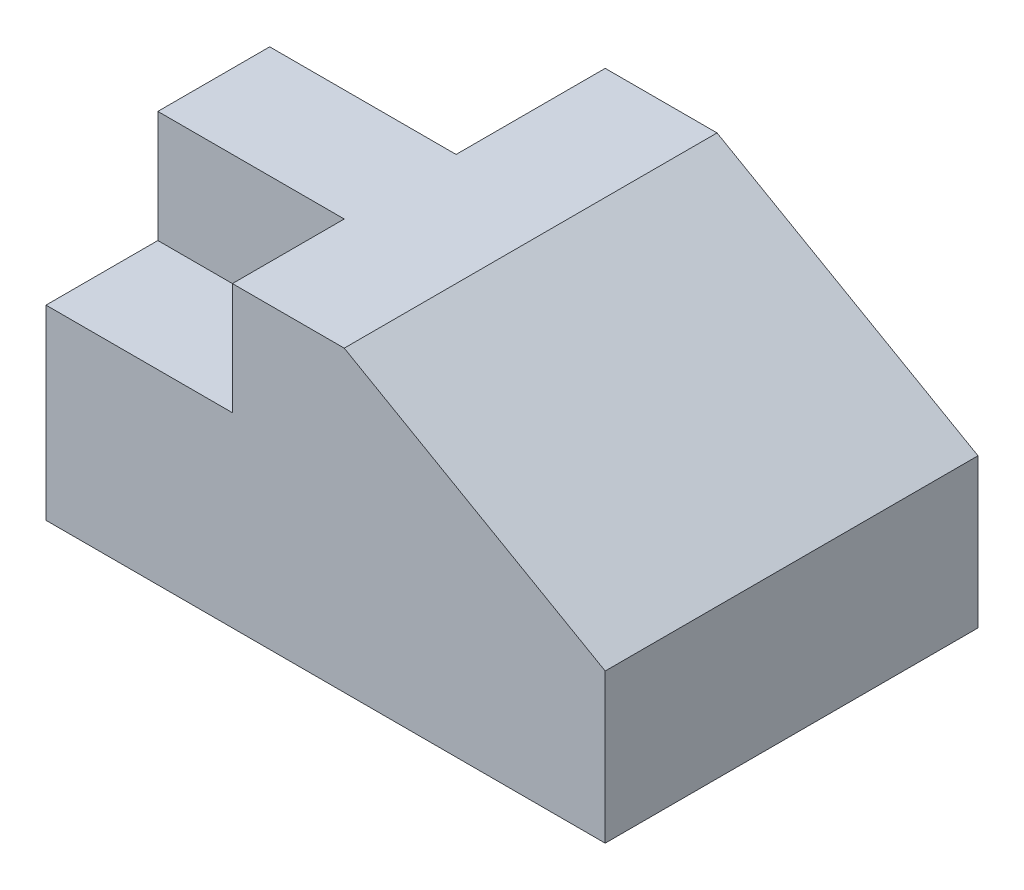
ISO-10303-21;
HEADER;
FILE_DESCRIPTION(('STEP AP214'),'2;1');
FILE_NAME('part.step','',(''),(''),'','','');
FILE_SCHEMA(('AUTOMOTIVE_DESIGN { 1 0 10303 214 1 1 1 1 }'));
ENDSEC;
DATA;
#1=APPLICATION_CONTEXT('core data for automotive mechanical design processes');
#2=APPLICATION_PROTOCOL_DEFINITION('international standard','automotive_design',2000,#1);
#3=PRODUCT_CONTEXT('',#1,'mechanical');
#4=PRODUCT('Part','Part','',(#3));
#5=PRODUCT_RELATED_PRODUCT_CATEGORY('part','',(#4));
#6=PRODUCT_DEFINITION_FORMATION('','',#4);
#7=PRODUCT_DEFINITION_CONTEXT('part definition',#1,'design');
#8=PRODUCT_DEFINITION('design','',#6,#7);
#9=PRODUCT_DEFINITION_SHAPE('','',#8);
#10=(LENGTH_UNIT() NAMED_UNIT(*) SI_UNIT(.MILLI.,.METRE.));
#11=(NAMED_UNIT(*) PLANE_ANGLE_UNIT() SI_UNIT($,.RADIAN.));
#12=(NAMED_UNIT(*) SI_UNIT($,.STERADIAN.) SOLID_ANGLE_UNIT());
#13=UNCERTAINTY_MEASURE_WITH_UNIT(LENGTH_MEASURE(1.E-05),#10,'distance_accuracy_value','');
#14=(GEOMETRIC_REPRESENTATION_CONTEXT(3) GLOBAL_UNCERTAINTY_ASSIGNED_CONTEXT((#13)) GLOBAL_UNIT_ASSIGNED_CONTEXT((#10,
#11,#12)) REPRESENTATION_CONTEXT('',''));
#15=CARTESIAN_POINT('',(0.,0.,0.));
#16=DIRECTION('',(0.,0.,1.));
#17=DIRECTION('',(1.,0.,0.));
#18=AXIS2_PLACEMENT_3D('',#15,#16,#17);
#19=CARTESIAN_POINT('',(50.,50.,100.));
#20=DIRECTION('',(1.,0.,0.));
#21=DIRECTION('',(0.,0.,-1.));
#22=AXIS2_PLACEMENT_3D('',#19,#20,#21);
#23=PLANE('',#22);
#24=DIRECTION('',(0.,1.,0.));
#25=VECTOR('',#24,1.);
#26=CARTESIAN_POINT('',(50.,50.,40.));
#27=LINE('',#26,#25);
#28=CARTESIAN_POINT('',(50.,0.,40.));
#29=VERTEX_POINT('',#28);
#30=CARTESIAN_POINT('',(50.,80.,40.));
#31=VERTEX_POINT('',#30);
#32=EDGE_CURVE('E203',#29,#31,#27,.T.);
#33=ORIENTED_EDGE('',*,*,#32,.T.);
#34=DIRECTION('',(0.,0.,-1.));
#35=VECTOR('',#34,1.);
#36=CARTESIAN_POINT('',(50.,80.,100.));
#37=LINE('',#36,#35);
#38=CARTESIAN_POINT('',(50.,80.,0.));
#39=VERTEX_POINT('',#38);
#40=EDGE_CURVE('E91',#31,#39,#37,.T.);
#41=ORIENTED_EDGE('',*,*,#40,.T.);
#42=DIRECTION('',(0.,-1.,0.));
#43=VECTOR('',#42,1.);
#44=CARTESIAN_POINT('',(50.,50.,0.));
#45=LINE('',#44,#43);
#46=CARTESIAN_POINT('',(50.,0.,0.));
#47=VERTEX_POINT('',#46);
#48=EDGE_CURVE('E157',#39,#47,#45,.T.);
#49=ORIENTED_EDGE('',*,*,#48,.T.);
#50=DIRECTION('',(0.,0.,-1.));
#51=VECTOR('',#50,1.);
#52=CARTESIAN_POINT('',(50.,0.,0.));
#53=LINE('',#52,#51);
#54=EDGE_CURVE('E218',#29,#47,#53,.T.);
#55=ORIENTED_EDGE('',*,*,#54,.F.);
#56=EDGE_LOOP('',(#33,#41,#49,#55));
#57=FACE_BOUND('',#56,.T.);
#58=ADVANCED_FACE('F47',(#57),#23,.F.);
#59=CARTESIAN_POINT('',(150.,0.,100.));
#60=DIRECTION('',(0.,1.,0.));
#61=DIRECTION('',(-1.,0.,0.));
#62=AXIS2_PLACEMENT_3D('',#59,#60,#61);
#63=PLANE('',#62);
#64=DIRECTION('',(1.,0.,0.));
#65=VECTOR('',#64,1.);
#66=CARTESIAN_POINT('',(0.,0.,40.));
#67=LINE('',#66,#65);
#68=CARTESIAN_POINT('',(0.,0.,40.));
#69=VERTEX_POINT('',#68);
#70=EDGE_CURVE('E225',#69,#29,#67,.T.);
#71=ORIENTED_EDGE('',*,*,#70,.T.);
#72=ORIENTED_EDGE('',*,*,#54,.T.);
#73=DIRECTION('',(1.,0.,0.));
#74=VECTOR('',#73,1.);
#75=CARTESIAN_POINT('',(150.,0.,0.));
#76=LINE('',#75,#74);
#77=CARTESIAN_POINT('',(150.,0.,0.));
#78=VERTEX_POINT('',#77);
#79=EDGE_CURVE('E146',#47,#78,#76,.T.);
#80=ORIENTED_EDGE('',*,*,#79,.T.);
#81=DIRECTION('',(0.,0.,-1.));
#82=VECTOR('',#81,1.);
#83=CARTESIAN_POINT('',(150.,0.,100.));
#84=LINE('',#83,#82);
#85=CARTESIAN_POINT('',(150.,0.,100.));
#86=VERTEX_POINT('',#85);
#87=EDGE_CURVE('E11',#86,#78,#84,.T.);
#88=ORIENTED_EDGE('',*,*,#87,.F.);
#89=DIRECTION('',(1.,0.,0.));
#90=VECTOR('',#89,1.);
#91=CARTESIAN_POINT('',(150.,0.,100.));
#92=LINE('',#91,#90);
#93=CARTESIAN_POINT('',(0.,0.,100.));
#94=VERTEX_POINT('',#93);
#95=EDGE_CURVE('E160',#94,#86,#92,.T.);
#96=ORIENTED_EDGE('',*,*,#95,.F.);
#97=DIRECTION('',(0.,0.,-1.));
#98=VECTOR('',#97,1.);
#99=CARTESIAN_POINT('',(0.,0.,100.));
#100=LINE('',#99,#98);
#101=EDGE_CURVE('E142',#94,#69,#100,.T.);
#102=ORIENTED_EDGE('',*,*,#101,.T.);
#103=EDGE_LOOP('',(#71,#72,#80,#88,#96,#102));
#104=FACE_BOUND('',#103,.T.);
#105=ADVANCED_FACE('F49',(#104),#63,.F.);
#106=CARTESIAN_POINT('',(150.,40.,100.));
#107=DIRECTION('',(-1.,0.,0.));
#108=DIRECTION('',(0.,0.,1.));
#109=AXIS2_PLACEMENT_3D('',#106,#107,#108);
#110=PLANE('',#109);
#111=DIRECTION('',(0.,1.,0.));
#112=VECTOR('',#111,1.);
#113=CARTESIAN_POINT('',(150.,40.,0.));
#114=LINE('',#113,#112);
#115=CARTESIAN_POINT('',(150.,40.,0.));
#116=VERTEX_POINT('',#115);
#117=EDGE_CURVE('E149',#78,#116,#114,.T.);
#118=ORIENTED_EDGE('',*,*,#117,.T.);
#119=DIRECTION('',(0.,0.,-1.));
#120=VECTOR('',#119,1.);
#121=CARTESIAN_POINT('',(150.,40.,100.));
#122=LINE('',#121,#120);
#123=CARTESIAN_POINT('',(150.,40.,100.));
#124=VERTEX_POINT('',#123);
#125=EDGE_CURVE('E57',#124,#116,#122,.T.);
#126=ORIENTED_EDGE('',*,*,#125,.F.);
#127=DIRECTION('',(0.,1.,0.));
#128=VECTOR('',#127,1.);
#129=CARTESIAN_POINT('',(150.,40.,100.));
#130=LINE('',#129,#128);
#131=EDGE_CURVE('E99',#86,#124,#130,.T.);
#132=ORIENTED_EDGE('',*,*,#131,.F.);
#133=ORIENTED_EDGE('',*,*,#87,.T.);
#134=EDGE_LOOP('',(#118,#126,#132,#133));
#135=FACE_BOUND('',#134,.T.);
#136=ADVANCED_FACE('F258',(#135),#110,.F.);
#137=CARTESIAN_POINT('',(80.,80.,100.));
#138=DIRECTION('',(-0.496138938356834,-0.868243142124459,0.));
#139=DIRECTION('',(0.868243142124459,-0.496138938356834,0.));
#140=AXIS2_PLACEMENT_3D('',#137,#138,#139);
#141=PLANE('',#140);
#142=DIRECTION('',(-0.868243142124459,0.496138938356834,0.));
#143=VECTOR('',#142,1.);
#144=CARTESIAN_POINT('',(80.,80.,0.));
#145=LINE('',#144,#143);
#146=CARTESIAN_POINT('',(80.,80.,0.));
#147=VERTEX_POINT('',#146);
#148=EDGE_CURVE('E83',#116,#147,#145,.T.);
#149=ORIENTED_EDGE('',*,*,#148,.T.);
#150=DIRECTION('',(0.,0.,-1.));
#151=VECTOR('',#150,1.);
#152=CARTESIAN_POINT('',(80.,80.,100.));
#153=LINE('',#152,#151);
#154=CARTESIAN_POINT('',(80.,80.,100.));
#155=VERTEX_POINT('',#154);
#156=EDGE_CURVE('E169',#155,#147,#153,.T.);
#157=ORIENTED_EDGE('',*,*,#156,.F.);
#158=DIRECTION('',(-0.868243142124459,0.496138938356834,0.));
#159=VECTOR('',#158,1.);
#160=CARTESIAN_POINT('',(80.,80.,100.));
#161=LINE('',#160,#159);
#162=EDGE_CURVE('E174',#124,#155,#161,.T.);
#163=ORIENTED_EDGE('',*,*,#162,.F.);
#164=ORIENTED_EDGE('',*,*,#125,.T.);
#165=EDGE_LOOP('',(#149,#157,#163,#164));
#166=FACE_BOUND('',#165,.T.);
#167=ADVANCED_FACE('F173',(#166),#141,.F.);
#168=CARTESIAN_POINT('',(50.,80.,100.));
#169=DIRECTION('',(0.,-1.,0.));
#170=DIRECTION('',(0.,0.,-1.));
#171=AXIS2_PLACEMENT_3D('',#168,#169,#170);
#172=PLANE('',#171);
#173=DIRECTION('',(-1.,0.,0.));
#174=VECTOR('',#173,1.);
#175=CARTESIAN_POINT('',(50.,80.,0.));
#176=LINE('',#175,#174);
#177=EDGE_CURVE('E154',#147,#39,#176,.T.);
#178=ORIENTED_EDGE('',*,*,#177,.T.);
#179=ORIENTED_EDGE('',*,*,#40,.F.);
#180=DIRECTION('',(1.,0.,0.));
#181=VECTOR('',#180,1.);
#182=CARTESIAN_POINT('',(0.,80.,40.));
#183=LINE('',#182,#181);
#184=CARTESIAN_POINT('',(0.,80.,40.));
#185=VERTEX_POINT('',#184);
#186=EDGE_CURVE('E207',#185,#31,#183,.T.);
#187=ORIENTED_EDGE('',*,*,#186,.F.);
#188=DIRECTION('',(0.,0.,1.));
#189=VECTOR('',#188,1.);
#190=CARTESIAN_POINT('',(0.,80.,40.));
#191=LINE('',#190,#189);
#192=CARTESIAN_POINT('',(0.,80.,70.));
#193=VERTEX_POINT('',#192);
#194=EDGE_CURVE('E211',#185,#193,#191,.T.);
#195=ORIENTED_EDGE('',*,*,#194,.T.);
#196=DIRECTION('',(1.,0.,0.));
#197=VECTOR('',#196,1.);
#198=CARTESIAN_POINT('',(0.,80.,70.));
#199=LINE('',#198,#197);
#200=CARTESIAN_POINT('',(50.,80.,70.));
#201=VERTEX_POINT('',#200);
#202=EDGE_CURVE('E215',#193,#201,#199,.T.);
#203=ORIENTED_EDGE('',*,*,#202,.T.);
#204=CARTESIAN_POINT('',(50.,80.,100.));
#205=VERTEX_POINT('',#204);
#206=EDGE_CURVE('E166',#205,#201,#37,.T.);
#207=ORIENTED_EDGE('',*,*,#206,.F.);
#208=DIRECTION('',(-1.,0.,0.));
#209=VECTOR('',#208,1.);
#210=CARTESIAN_POINT('',(50.,80.,100.));
#211=LINE('',#210,#209);
#212=EDGE_CURVE('E119',#155,#205,#211,.T.);
#213=ORIENTED_EDGE('',*,*,#212,.F.);
#214=ORIENTED_EDGE('',*,*,#156,.T.);
#215=EDGE_LOOP('',(#178,#179,#187,#195,#203,#207,#213,#214));
#216=FACE_BOUND('',#215,.T.);
#217=ADVANCED_FACE('F182',(#216),#172,.F.);
#218=ORIENTED_EDGE('',*,*,#206,.T.);
#219=DIRECTION('',(0.,1.,0.));
#220=VECTOR('',#219,1.);
#221=CARTESIAN_POINT('',(50.,50.,70.));
#222=LINE('',#221,#220);
#223=CARTESIAN_POINT('',(50.,50.,70.));
#224=VERTEX_POINT('',#223);
#225=EDGE_CURVE('E131',#224,#201,#222,.T.);
#226=ORIENTED_EDGE('',*,*,#225,.F.);
#227=DIRECTION('',(0.,0.,-1.));
#228=VECTOR('',#227,1.);
#229=CARTESIAN_POINT('',(50.,50.,100.));
#230=LINE('',#229,#228);
#231=CARTESIAN_POINT('',(50.,50.,100.));
#232=VERTEX_POINT('',#231);
#233=EDGE_CURVE('E127',#232,#224,#230,.T.);
#234=ORIENTED_EDGE('',*,*,#233,.F.);
#235=DIRECTION('',(0.,-1.,0.));
#236=VECTOR('',#235,1.);
#237=CARTESIAN_POINT('',(50.,50.,100.));
#238=LINE('',#237,#236);
#239=EDGE_CURVE('E112',#205,#232,#238,.T.);
#240=ORIENTED_EDGE('',*,*,#239,.F.);
#241=EDGE_LOOP('',(#218,#226,#234,#240));
#242=FACE_BOUND('',#241,.T.);
#243=ADVANCED_FACE('F128',(#242),#23,.F.);
#244=CARTESIAN_POINT('',(0.,50.,100.));
#245=DIRECTION('',(0.,-1.,0.));
#246=DIRECTION('',(0.,0.,-1.));
#247=AXIS2_PLACEMENT_3D('',#244,#245,#246);
#248=PLANE('',#247);
#249=ORIENTED_EDGE('',*,*,#233,.T.);
#250=DIRECTION('',(1.,0.,0.));
#251=VECTOR('',#250,1.);
#252=CARTESIAN_POINT('',(0.,50.,70.));
#253=LINE('',#252,#251);
#254=CARTESIAN_POINT('',(0.,50.,70.));
#255=VERTEX_POINT('',#254);
#256=EDGE_CURVE('E206',#255,#224,#253,.T.);
#257=ORIENTED_EDGE('',*,*,#256,.F.);
#258=DIRECTION('',(0.,0.,-1.));
#259=VECTOR('',#258,1.);
#260=CARTESIAN_POINT('',(0.,50.,100.));
#261=LINE('',#260,#259);
#262=CARTESIAN_POINT('',(0.,50.,100.));
#263=VERTEX_POINT('',#262);
#264=EDGE_CURVE('E135',#263,#255,#261,.T.);
#265=ORIENTED_EDGE('',*,*,#264,.F.);
#266=DIRECTION('',(-1.,0.,0.));
#267=VECTOR('',#266,1.);
#268=CARTESIAN_POINT('',(0.,50.,100.));
#269=LINE('',#268,#267);
#270=EDGE_CURVE('E116',#232,#263,#269,.T.);
#271=ORIENTED_EDGE('',*,*,#270,.F.);
#272=EDGE_LOOP('',(#249,#257,#265,#271));
#273=FACE_BOUND('',#272,.T.);
#274=ADVANCED_FACE('F137',(#273),#248,.F.);
#275=CARTESIAN_POINT('',(0.,0.,100.));
#276=DIRECTION('',(1.,0.,0.));
#277=DIRECTION('',(0.,0.,-1.));
#278=AXIS2_PLACEMENT_3D('',#275,#276,#277);
#279=PLANE('',#278);
#280=DIRECTION('',(0.,1.,0.));
#281=VECTOR('',#280,1.);
#282=CARTESIAN_POINT('',(0.,50.,40.));
#283=LINE('',#282,#281);
#284=EDGE_CURVE('E199',#69,#185,#283,.T.);
#285=ORIENTED_EDGE('',*,*,#284,.F.);
#286=ORIENTED_EDGE('',*,*,#101,.F.);
#287=DIRECTION('',(0.,-1.,0.));
#288=VECTOR('',#287,1.);
#289=CARTESIAN_POINT('',(0.,0.,100.));
#290=LINE('',#289,#288);
#291=EDGE_CURVE('E65',#263,#94,#290,.T.);
#292=ORIENTED_EDGE('',*,*,#291,.F.);
#293=ORIENTED_EDGE('',*,*,#264,.T.);
#294=DIRECTION('',(0.,1.,0.));
#295=VECTOR('',#294,1.);
#296=CARTESIAN_POINT('',(0.,50.,70.));
#297=LINE('',#296,#295);
#298=EDGE_CURVE('E195',#255,#193,#297,.T.);
#299=ORIENTED_EDGE('',*,*,#298,.T.);
#300=ORIENTED_EDGE('',*,*,#194,.F.);
#301=EDGE_LOOP('',(#285,#286,#292,#293,#299,#300));
#302=FACE_BOUND('',#301,.T.);
#303=ADVANCED_FACE('F266',(#302),#279,.F.);
#304=CARTESIAN_POINT('',(0.,0.,100.));
#305=DIRECTION('',(0.,0.,-1.));
#306=DIRECTION('',(-1.,0.,0.));
#307=AXIS2_PLACEMENT_3D('',#304,#305,#306);
#308=PLANE('',#307);
#309=ORIENTED_EDGE('',*,*,#95,.T.);
#310=ORIENTED_EDGE('',*,*,#131,.T.);
#311=ORIENTED_EDGE('',*,*,#162,.T.);
#312=ORIENTED_EDGE('',*,*,#212,.T.);
#313=ORIENTED_EDGE('',*,*,#239,.T.);
#314=ORIENTED_EDGE('',*,*,#270,.T.);
#315=ORIENTED_EDGE('',*,*,#291,.T.);
#316=EDGE_LOOP('',(#309,#310,#311,#312,#313,#314,#315));
#317=FACE_BOUND('',#316,.T.);
#318=ADVANCED_FACE('F114',(#317),#308,.F.);
#319=CARTESIAN_POINT('',(0.,0.,0.));
#320=DIRECTION('',(0.,0.,-1.));
#321=DIRECTION('',(-1.,0.,0.));
#322=AXIS2_PLACEMENT_3D('',#319,#320,#321);
#323=PLANE('',#322);
#324=ORIENTED_EDGE('',*,*,#79,.F.);
#325=ORIENTED_EDGE('',*,*,#48,.F.);
#326=ORIENTED_EDGE('',*,*,#177,.F.);
#327=ORIENTED_EDGE('',*,*,#148,.F.);
#328=ORIENTED_EDGE('',*,*,#117,.F.);
#329=EDGE_LOOP('',(#324,#325,#326,#327,#328));
#330=FACE_BOUND('',#329,.T.);
#331=ADVANCED_FACE('F179',(#330),#323,.T.);
#332=CARTESIAN_POINT('',(0.,50.,70.));
#333=DIRECTION('',(0.,0.,1.));
#334=DIRECTION('',(1.,0.,0.));
#335=AXIS2_PLACEMENT_3D('',#332,#333,#334);
#336=PLANE('',#335);
#337=ORIENTED_EDGE('',*,*,#202,.F.);
#338=ORIENTED_EDGE('',*,*,#298,.F.);
#339=ORIENTED_EDGE('',*,*,#256,.T.);
#340=ORIENTED_EDGE('',*,*,#225,.T.);
#341=EDGE_LOOP('',(#337,#338,#339,#340));
#342=FACE_BOUND('',#341,.T.);
#343=ADVANCED_FACE('F305',(#342),#336,.T.);
#344=CARTESIAN_POINT('',(0.,50.,40.));
#345=DIRECTION('',(0.,0.,1.));
#346=DIRECTION('',(1.,0.,0.));
#347=AXIS2_PLACEMENT_3D('',#344,#345,#346);
#348=PLANE('',#347);
#349=ORIENTED_EDGE('',*,*,#186,.T.);
#350=ORIENTED_EDGE('',*,*,#32,.F.);
#351=ORIENTED_EDGE('',*,*,#70,.F.);
#352=ORIENTED_EDGE('',*,*,#284,.T.);
#353=EDGE_LOOP('',(#349,#350,#351,#352));
#354=FACE_BOUND('',#353,.T.);
#355=ADVANCED_FACE('F238',(#354),#348,.F.);
#356=CLOSED_SHELL('',(#58,#105,#136,#167,#217,#243,#274,#303,#318,#331,#343,#355));
#357=MANIFOLD_SOLID_BREP('B2',#356);
#358=ADVANCED_BREP_SHAPE_REPRESENTATION('',(#18,#357),#14);
#359=SHAPE_DEFINITION_REPRESENTATION(#9,#358);
ENDSEC;
END-ISO-10303-21;
